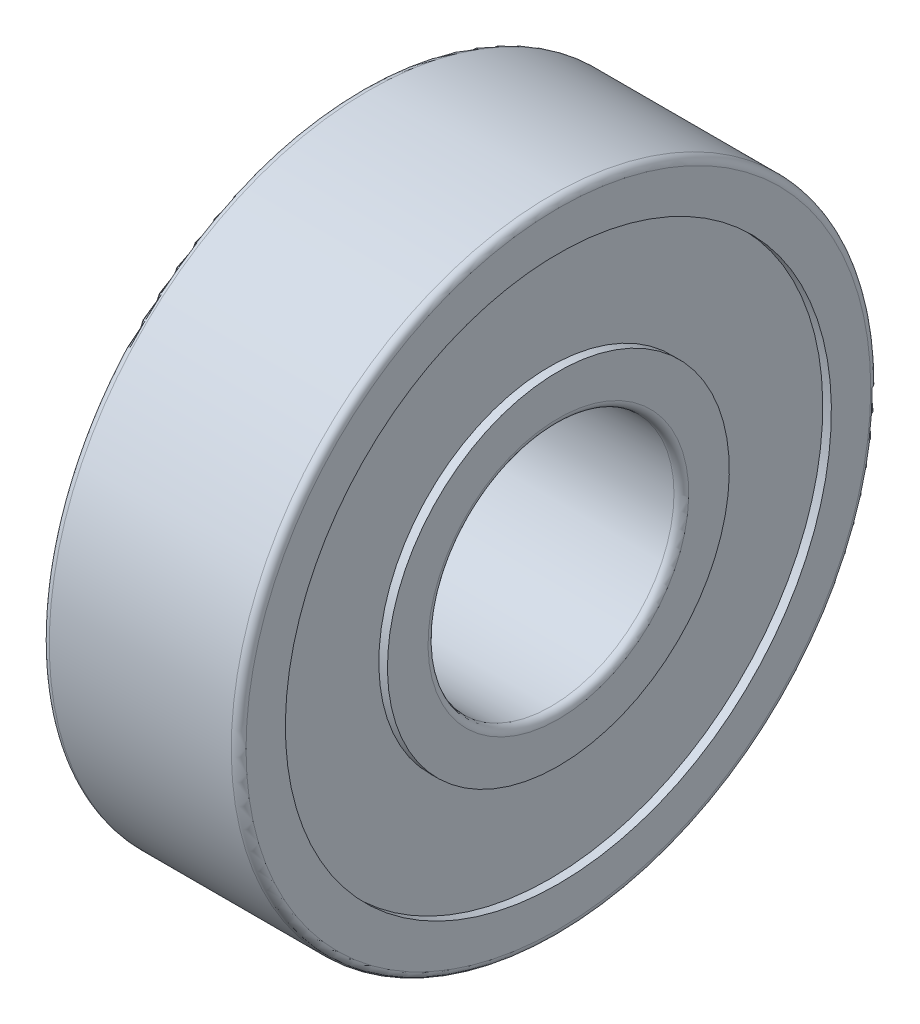
ISO-10303-21;
HEADER;
FILE_DESCRIPTION(('STEP AP214'),'2;1');
FILE_NAME('part.step','',(''),(''),'','','');
FILE_SCHEMA(('AUTOMOTIVE_DESIGN { 1 0 10303 214 1 1 1 1 }'));
ENDSEC;
DATA;
#1=APPLICATION_CONTEXT('core data for automotive mechanical design processes');
#2=APPLICATION_PROTOCOL_DEFINITION('international standard','automotive_design',2000,#1);
#3=PRODUCT_CONTEXT('',#1,'mechanical');
#4=PRODUCT('Part','Part','',(#3));
#5=PRODUCT_RELATED_PRODUCT_CATEGORY('part','',(#4));
#6=PRODUCT_DEFINITION_FORMATION('','',#4);
#7=PRODUCT_DEFINITION_CONTEXT('part definition',#1,'design');
#8=PRODUCT_DEFINITION('design','',#6,#7);
#9=PRODUCT_DEFINITION_SHAPE('','',#8);
#10=(LENGTH_UNIT() NAMED_UNIT(*) SI_UNIT(.MILLI.,.METRE.));
#11=(NAMED_UNIT(*) PLANE_ANGLE_UNIT() SI_UNIT($,.RADIAN.));
#12=(NAMED_UNIT(*) SI_UNIT($,.STERADIAN.) SOLID_ANGLE_UNIT());
#13=UNCERTAINTY_MEASURE_WITH_UNIT(LENGTH_MEASURE(1.E-05),#10,'distance_accuracy_value','');
#14=(GEOMETRIC_REPRESENTATION_CONTEXT(3) GLOBAL_UNCERTAINTY_ASSIGNED_CONTEXT((#13)) GLOBAL_UNIT_ASSIGNED_CONTEXT((#10,
#11,#12)) REPRESENTATION_CONTEXT('',''));
#15=CARTESIAN_POINT('',(0.,0.,0.));
#16=DIRECTION('',(0.,0.,1.));
#17=DIRECTION('',(1.,0.,0.));
#18=AXIS2_PLACEMENT_3D('',#15,#16,#17);
#19=CARTESIAN_POINT('',(0.,0.,0.));
#20=DIRECTION('',(-1.,0.,0.));
#21=DIRECTION('',(0.,-1.,0.));
#22=AXIS2_PLACEMENT_3D('',#19,#20,#21);
#23=CYLINDRICAL_SURFACE('',#22,5.);
#24=CARTESIAN_POINT('',(0.3,0.,0.));
#25=DIRECTION('',(1.,0.,0.));
#26=DIRECTION('',(0.,1.,0.));
#27=AXIS2_PLACEMENT_3D('',#24,#25,#26);
#28=CIRCLE('',#27,5.);
#29=CARTESIAN_POINT('',(0.3,5.,0.));
#30=VERTEX_POINT('',#29);
#31=EDGE_CURVE('E57',#30,#30,#28,.F.);
#32=ORIENTED_EDGE('',*,*,#31,.T.);
#33=EDGE_LOOP('',(#32));
#34=FACE_BOUND('',#33,.T.);
#35=CARTESIAN_POINT('',(7.7,0.,0.));
#36=DIRECTION('',(-1.,0.,0.));
#37=DIRECTION('',(0.,-1.,0.));
#38=AXIS2_PLACEMENT_3D('',#35,#36,#37);
#39=CIRCLE('',#38,5.);
#40=CARTESIAN_POINT('',(7.7,-5.,0.));
#41=VERTEX_POINT('',#40);
#42=EDGE_CURVE('E60',#41,#41,#39,.F.);
#43=ORIENTED_EDGE('',*,*,#42,.T.);
#44=EDGE_LOOP('',(#43));
#45=FACE_BOUND('',#44,.T.);
#46=ADVANCED_FACE('F31',(#34,#45),#23,.F.);
#47=CARTESIAN_POINT('',(0.,5.,0.));
#48=DIRECTION('',(1.,0.,0.));
#49=DIRECTION('',(0.,1.,0.));
#50=AXIS2_PLACEMENT_3D('',#47,#48,#49);
#51=PLANE('',#50);
#52=CARTESIAN_POINT('',(0.,0.,0.));
#53=DIRECTION('',(1.,0.,0.));
#54=DIRECTION('',(0.,1.,0.));
#55=AXIS2_PLACEMENT_3D('',#52,#53,#54);
#56=CIRCLE('',#55,5.3);
#57=CARTESIAN_POINT('',(0.,5.3,0.));
#58=VERTEX_POINT('',#57);
#59=EDGE_CURVE('E54',#58,#58,#56,.T.);
#60=ORIENTED_EDGE('',*,*,#59,.T.);
#61=EDGE_LOOP('',(#60));
#62=FACE_BOUND('',#61,.T.);
#63=CARTESIAN_POINT('',(0.,0.,0.));
#64=DIRECTION('',(-1.,0.,0.));
#65=DIRECTION('',(0.,-1.,0.));
#66=AXIS2_PLACEMENT_3D('',#63,#64,#65);
#67=CIRCLE('',#66,6.95);
#68=CARTESIAN_POINT('',(0.,-6.95,0.));
#69=VERTEX_POINT('',#68);
#70=EDGE_CURVE('E63',#69,#69,#67,.T.);
#71=ORIENTED_EDGE('',*,*,#70,.T.);
#72=EDGE_LOOP('',(#71));
#73=FACE_BOUND('',#72,.T.);
#74=ADVANCED_FACE('F106',(#62,#73),#51,.F.);
#75=CARTESIAN_POINT('',(0.,0.,0.));
#76=DIRECTION('',(-1.,0.,0.));
#77=DIRECTION('',(0.,-1.,0.));
#78=AXIS2_PLACEMENT_3D('',#75,#76,#77);
#79=CYLINDRICAL_SURFACE('',#78,6.95);
#80=ORIENTED_EDGE('',*,*,#70,.F.);
#81=EDGE_LOOP('',(#80));
#82=FACE_BOUND('',#81,.T.);
#83=CARTESIAN_POINT('',(0.35,0.,0.));
#84=DIRECTION('',(-1.,0.,0.));
#85=DIRECTION('',(0.,-1.,0.));
#86=AXIS2_PLACEMENT_3D('',#83,#84,#85);
#87=CIRCLE('',#86,6.95);
#88=CARTESIAN_POINT('',(0.35,-6.95,0.));
#89=VERTEX_POINT('',#88);
#90=EDGE_CURVE('E66',#89,#89,#87,.T.);
#91=ORIENTED_EDGE('',*,*,#90,.T.);
#92=EDGE_LOOP('',(#91));
#93=FACE_BOUND('',#92,.T.);
#94=ADVANCED_FACE('F112',(#82,#93),#79,.T.);
#95=CARTESIAN_POINT('',(0.35,6.95,0.));
#96=DIRECTION('',(1.,0.,0.));
#97=DIRECTION('',(0.,1.,0.));
#98=AXIS2_PLACEMENT_3D('',#95,#96,#97);
#99=PLANE('',#98);
#100=ORIENTED_EDGE('',*,*,#90,.F.);
#101=EDGE_LOOP('',(#100));
#102=FACE_BOUND('',#101,.T.);
#103=CARTESIAN_POINT('',(0.35,0.,0.));
#104=DIRECTION('',(-1.,0.,0.));
#105=DIRECTION('',(0.,-1.,0.));
#106=AXIS2_PLACEMENT_3D('',#103,#104,#105);
#107=CIRCLE('',#106,11.1);
#108=CARTESIAN_POINT('',(0.35,-11.1,0.));
#109=VERTEX_POINT('',#108);
#110=EDGE_CURVE('E69',#109,#109,#107,.T.);
#111=ORIENTED_EDGE('',*,*,#110,.T.);
#112=EDGE_LOOP('',(#111));
#113=FACE_BOUND('',#112,.T.);
#114=ADVANCED_FACE('F139',(#102,#113),#99,.F.);
#115=CARTESIAN_POINT('',(0.,0.,0.));
#116=DIRECTION('',(-1.,0.,0.));
#117=DIRECTION('',(0.,-1.,0.));
#118=AXIS2_PLACEMENT_3D('',#115,#116,#117);
#119=CYLINDRICAL_SURFACE('',#118,11.1);
#120=ORIENTED_EDGE('',*,*,#110,.F.);
#121=EDGE_LOOP('',(#120));
#122=FACE_BOUND('',#121,.T.);
#123=CARTESIAN_POINT('',(0.,0.,0.));
#124=DIRECTION('',(-1.,0.,0.));
#125=DIRECTION('',(0.,-1.,0.));
#126=AXIS2_PLACEMENT_3D('',#123,#124,#125);
#127=CIRCLE('',#126,11.1);
#128=CARTESIAN_POINT('',(0.,-11.1,0.));
#129=VERTEX_POINT('',#128);
#130=EDGE_CURVE('E72',#129,#129,#127,.T.);
#131=ORIENTED_EDGE('',*,*,#130,.T.);
#132=EDGE_LOOP('',(#131));
#133=FACE_BOUND('',#132,.T.);
#134=ADVANCED_FACE('F134',(#122,#133),#119,.F.);
#135=CARTESIAN_POINT('',(0.,11.1,0.));
#136=DIRECTION('',(1.,0.,0.));
#137=DIRECTION('',(0.,1.,0.));
#138=AXIS2_PLACEMENT_3D('',#135,#136,#137);
#139=PLANE('',#138);
#140=CARTESIAN_POINT('',(0.,0.,0.));
#141=DIRECTION('',(1.,0.,0.));
#142=DIRECTION('',(0.,1.,0.));
#143=AXIS2_PLACEMENT_3D('',#140,#141,#142);
#144=CIRCLE('',#143,12.7);
#145=CARTESIAN_POINT('',(0.,12.7,0.));
#146=VERTEX_POINT('',#145);
#147=EDGE_CURVE('E46',#146,#146,#144,.F.);
#148=ORIENTED_EDGE('',*,*,#147,.T.);
#149=EDGE_LOOP('',(#148));
#150=FACE_BOUND('',#149,.T.);
#151=ORIENTED_EDGE('',*,*,#130,.F.);
#152=EDGE_LOOP('',(#151));
#153=FACE_BOUND('',#152,.T.);
#154=ADVANCED_FACE('F130',(#150,#153),#139,.F.);
#155=CARTESIAN_POINT('',(0.,0.,0.));
#156=DIRECTION('',(-1.,0.,0.));
#157=DIRECTION('',(0.,-1.,0.));
#158=AXIS2_PLACEMENT_3D('',#155,#156,#157);
#159=CYLINDRICAL_SURFACE('',#158,13.);
#160=CARTESIAN_POINT('',(0.3,0.,0.));
#161=DIRECTION('',(1.,0.,0.));
#162=DIRECTION('',(0.,1.,0.));
#163=AXIS2_PLACEMENT_3D('',#160,#161,#162);
#164=CIRCLE('',#163,13.);
#165=CARTESIAN_POINT('',(0.3,13.,0.));
#166=VERTEX_POINT('',#165);
#167=EDGE_CURVE('E38',#166,#166,#164,.T.);
#168=ORIENTED_EDGE('',*,*,#167,.T.);
#169=EDGE_LOOP('',(#168));
#170=FACE_BOUND('',#169,.T.);
#171=CARTESIAN_POINT('',(7.7,0.,0.));
#172=DIRECTION('',(-1.,0.,0.));
#173=DIRECTION('',(0.,-1.,0.));
#174=AXIS2_PLACEMENT_3D('',#171,#172,#173);
#175=CIRCLE('',#174,13.);
#176=CARTESIAN_POINT('',(7.7,-13.,0.));
#177=VERTEX_POINT('',#176);
#178=EDGE_CURVE('E42',#177,#177,#175,.T.);
#179=ORIENTED_EDGE('',*,*,#178,.T.);
#180=EDGE_LOOP('',(#179));
#181=FACE_BOUND('',#180,.T.);
#182=ADVANCED_FACE('F133',(#170,#181),#159,.T.);
#183=CARTESIAN_POINT('',(8.,13.,0.));
#184=DIRECTION('',(-1.,0.,0.));
#185=DIRECTION('',(0.,-1.,0.));
#186=AXIS2_PLACEMENT_3D('',#183,#184,#185);
#187=PLANE('',#186);
#188=CARTESIAN_POINT('',(8.,0.,0.));
#189=DIRECTION('',(-1.,0.,0.));
#190=DIRECTION('',(0.,-1.,0.));
#191=AXIS2_PLACEMENT_3D('',#188,#189,#190);
#192=CIRCLE('',#191,12.7);
#193=CARTESIAN_POINT('',(8.,-12.7,0.));
#194=VERTEX_POINT('',#193);
#195=EDGE_CURVE('E10',#194,#194,#192,.F.);
#196=ORIENTED_EDGE('',*,*,#195,.T.);
#197=EDGE_LOOP('',(#196));
#198=FACE_BOUND('',#197,.T.);
#199=CARTESIAN_POINT('',(8.,0.,0.));
#200=DIRECTION('',(-1.,0.,0.));
#201=DIRECTION('',(0.,-1.,0.));
#202=AXIS2_PLACEMENT_3D('',#199,#200,#201);
#203=CIRCLE('',#202,11.1);
#204=CARTESIAN_POINT('',(8.,-11.1,0.));
#205=VERTEX_POINT('',#204);
#206=EDGE_CURVE('E75',#205,#205,#203,.T.);
#207=ORIENTED_EDGE('',*,*,#206,.T.);
#208=EDGE_LOOP('',(#207));
#209=FACE_BOUND('',#208,.T.);
#210=ADVANCED_FACE('F179',(#198,#209),#187,.F.);
#211=CARTESIAN_POINT('',(0.,0.,0.));
#212=DIRECTION('',(-1.,0.,0.));
#213=DIRECTION('',(0.,-1.,0.));
#214=AXIS2_PLACEMENT_3D('',#211,#212,#213);
#215=CYLINDRICAL_SURFACE('',#214,11.1);
#216=ORIENTED_EDGE('',*,*,#206,.F.);
#217=EDGE_LOOP('',(#216));
#218=FACE_BOUND('',#217,.T.);
#219=CARTESIAN_POINT('',(7.65,0.,0.));
#220=DIRECTION('',(-1.,0.,0.));
#221=DIRECTION('',(0.,-1.,0.));
#222=AXIS2_PLACEMENT_3D('',#219,#220,#221);
#223=CIRCLE('',#222,11.1);
#224=CARTESIAN_POINT('',(7.65,-11.1,0.));
#225=VERTEX_POINT('',#224);
#226=EDGE_CURVE('E78',#225,#225,#223,.T.);
#227=ORIENTED_EDGE('',*,*,#226,.T.);
#228=EDGE_LOOP('',(#227));
#229=FACE_BOUND('',#228,.T.);
#230=ADVANCED_FACE('F174',(#218,#229),#215,.F.);
#231=CARTESIAN_POINT('',(7.65,11.1,0.));
#232=DIRECTION('',(-1.,0.,0.));
#233=DIRECTION('',(0.,-1.,0.));
#234=AXIS2_PLACEMENT_3D('',#231,#232,#233);
#235=PLANE('',#234);
#236=ORIENTED_EDGE('',*,*,#226,.F.);
#237=EDGE_LOOP('',(#236));
#238=FACE_BOUND('',#237,.T.);
#239=CARTESIAN_POINT('',(7.65,0.,0.));
#240=DIRECTION('',(-1.,0.,0.));
#241=DIRECTION('',(0.,-1.,0.));
#242=AXIS2_PLACEMENT_3D('',#239,#240,#241);
#243=CIRCLE('',#242,6.95);
#244=CARTESIAN_POINT('',(7.65,-6.95,0.));
#245=VERTEX_POINT('',#244);
#246=EDGE_CURVE('E81',#245,#245,#243,.T.);
#247=ORIENTED_EDGE('',*,*,#246,.T.);
#248=EDGE_LOOP('',(#247));
#249=FACE_BOUND('',#248,.T.);
#250=ADVANCED_FACE('F102',(#238,#249),#235,.F.);
#251=CARTESIAN_POINT('',(0.,0.,0.));
#252=DIRECTION('',(-1.,0.,0.));
#253=DIRECTION('',(0.,-1.,0.));
#254=AXIS2_PLACEMENT_3D('',#251,#252,#253);
#255=CYLINDRICAL_SURFACE('',#254,6.95);
#256=ORIENTED_EDGE('',*,*,#246,.F.);
#257=EDGE_LOOP('',(#256));
#258=FACE_BOUND('',#257,.T.);
#259=CARTESIAN_POINT('',(8.,0.,0.));
#260=DIRECTION('',(-1.,0.,0.));
#261=DIRECTION('',(0.,-1.,0.));
#262=AXIS2_PLACEMENT_3D('',#259,#260,#261);
#263=CIRCLE('',#262,6.95);
#264=CARTESIAN_POINT('',(8.,-6.95,0.));
#265=VERTEX_POINT('',#264);
#266=EDGE_CURVE('E84',#265,#265,#263,.T.);
#267=ORIENTED_EDGE('',*,*,#266,.T.);
#268=EDGE_LOOP('',(#267));
#269=FACE_BOUND('',#268,.T.);
#270=ADVANCED_FACE('F88',(#258,#269),#255,.T.);
#271=CARTESIAN_POINT('',(8.,6.95,0.));
#272=DIRECTION('',(-1.,0.,0.));
#273=DIRECTION('',(0.,-1.,0.));
#274=AXIS2_PLACEMENT_3D('',#271,#272,#273);
#275=PLANE('',#274);
#276=CARTESIAN_POINT('',(8.,0.,0.));
#277=DIRECTION('',(-1.,0.,0.));
#278=DIRECTION('',(0.,-1.,0.));
#279=AXIS2_PLACEMENT_3D('',#276,#277,#278);
#280=CIRCLE('',#279,5.3);
#281=CARTESIAN_POINT('',(8.,-5.3,0.));
#282=VERTEX_POINT('',#281);
#283=EDGE_CURVE('E51',#282,#282,#280,.T.);
#284=ORIENTED_EDGE('',*,*,#283,.T.);
#285=EDGE_LOOP('',(#284));
#286=FACE_BOUND('',#285,.T.);
#287=ORIENTED_EDGE('',*,*,#266,.F.);
#288=EDGE_LOOP('',(#287));
#289=FACE_BOUND('',#288,.T.);
#290=ADVANCED_FACE('F90',(#286,#289),#275,.F.);
#291=CARTESIAN_POINT('',(0.3,0.,0.));
#292=DIRECTION('',(1.,0.,0.));
#293=DIRECTION('',(0.,1.,0.));
#294=AXIS2_PLACEMENT_3D('',#291,#292,#293);
#295=TOROIDAL_SURFACE('',#294,5.3,0.3);
#296=ORIENTED_EDGE('',*,*,#59,.F.);
#297=EDGE_LOOP('',(#296));
#298=FACE_BOUND('',#297,.T.);
#299=ORIENTED_EDGE('',*,*,#31,.F.);
#300=EDGE_LOOP('',(#299));
#301=FACE_BOUND('',#300,.T.);
#302=ADVANCED_FACE('F92',(#298,#301),#295,.T.);
#303=CARTESIAN_POINT('',(7.7,0.,0.));
#304=DIRECTION('',(-1.,0.,0.));
#305=DIRECTION('',(0.,-1.,0.));
#306=AXIS2_PLACEMENT_3D('',#303,#304,#305);
#307=TOROIDAL_SURFACE('',#306,5.3,0.3);
#308=ORIENTED_EDGE('',*,*,#42,.F.);
#309=EDGE_LOOP('',(#308));
#310=FACE_BOUND('',#309,.T.);
#311=ORIENTED_EDGE('',*,*,#283,.F.);
#312=EDGE_LOOP('',(#311));
#313=FACE_BOUND('',#312,.T.);
#314=ADVANCED_FACE('F99',(#310,#313),#307,.T.);
#315=CARTESIAN_POINT('',(0.3,0.,0.));
#316=DIRECTION('',(1.,0.,0.));
#317=DIRECTION('',(0.,1.,0.));
#318=AXIS2_PLACEMENT_3D('',#315,#316,#317);
#319=TOROIDAL_SURFACE('',#318,12.7,0.3);
#320=ORIENTED_EDGE('',*,*,#167,.F.);
#321=EDGE_LOOP('',(#320));
#322=FACE_BOUND('',#321,.T.);
#323=ORIENTED_EDGE('',*,*,#147,.F.);
#324=EDGE_LOOP('',(#323));
#325=FACE_BOUND('',#324,.T.);
#326=ADVANCED_FACE('F119',(#322,#325),#319,.T.);
#327=CARTESIAN_POINT('',(7.7,0.,0.));
#328=DIRECTION('',(-1.,0.,0.));
#329=DIRECTION('',(0.,-1.,0.));
#330=AXIS2_PLACEMENT_3D('',#327,#328,#329);
#331=TOROIDAL_SURFACE('',#330,12.7,0.3);
#332=ORIENTED_EDGE('',*,*,#195,.F.);
#333=EDGE_LOOP('',(#332));
#334=FACE_BOUND('',#333,.T.);
#335=ORIENTED_EDGE('',*,*,#178,.F.);
#336=EDGE_LOOP('',(#335));
#337=FACE_BOUND('',#336,.T.);
#338=ADVANCED_FACE('F33',(#334,#337),#331,.T.);
#339=CLOSED_SHELL('',(#46,#74,#94,#114,#134,#154,#182,#210,#230,#250,#270,#290,#302,#314,#326,#338));
#340=MANIFOLD_SOLID_BREP('B2',#339);
#341=ADVANCED_BREP_SHAPE_REPRESENTATION('',(#18,#340),#14);
#342=SHAPE_DEFINITION_REPRESENTATION(#9,#341);
ENDSEC;
END-ISO-10303-21;
